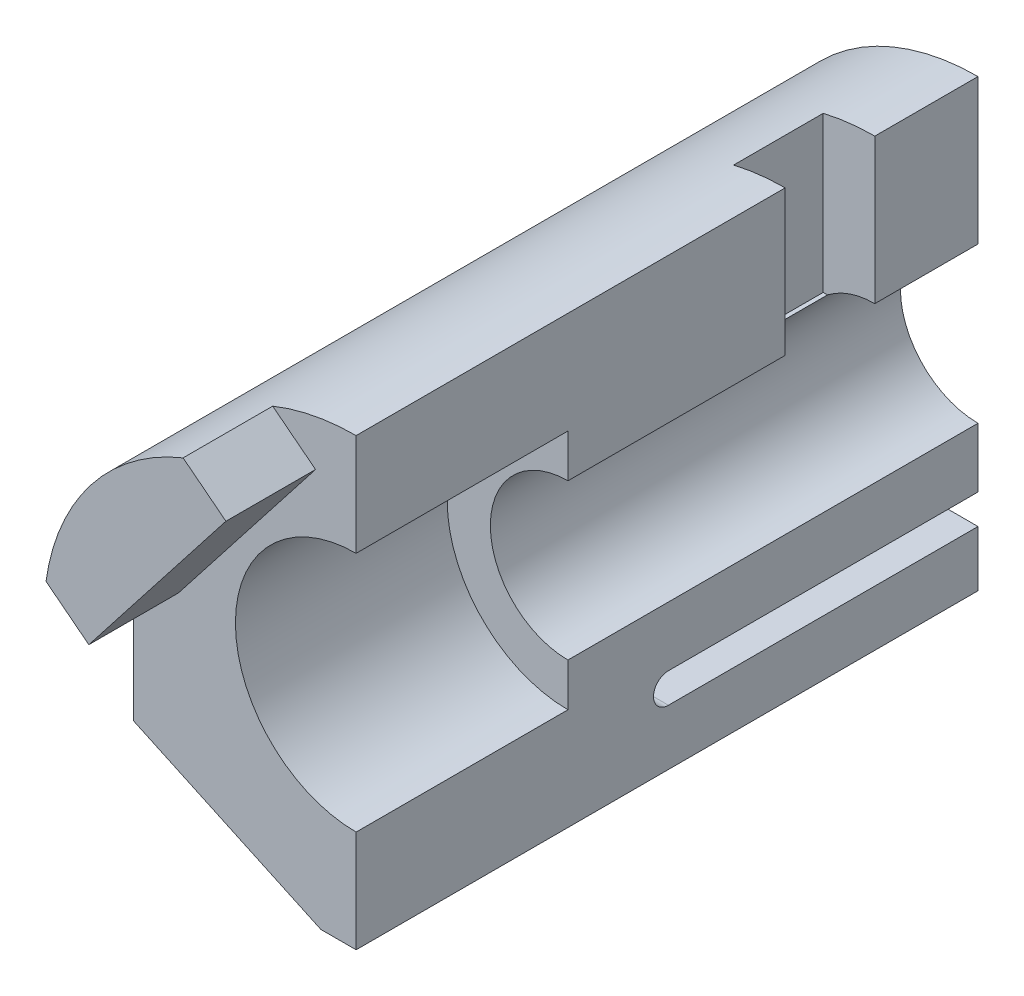
ISO-10303-21;
HEADER;
FILE_DESCRIPTION(('STEP AP214'),'2;1');
FILE_NAME('part.step','',(''),(''),'','','');
FILE_SCHEMA(('AUTOMOTIVE_DESIGN { 1 0 10303 214 1 1 1 1 }'));
ENDSEC;
DATA;
#1=APPLICATION_CONTEXT('core data for automotive mechanical design processes');
#2=APPLICATION_PROTOCOL_DEFINITION('international standard','automotive_design',2000,#1);
#3=PRODUCT_CONTEXT('',#1,'mechanical');
#4=PRODUCT('Part','Part','',(#3));
#5=PRODUCT_RELATED_PRODUCT_CATEGORY('part','',(#4));
#6=PRODUCT_DEFINITION_FORMATION('','',#4);
#7=PRODUCT_DEFINITION_CONTEXT('part definition',#1,'design');
#8=PRODUCT_DEFINITION('design','',#6,#7);
#9=PRODUCT_DEFINITION_SHAPE('','',#8);
#10=(LENGTH_UNIT() NAMED_UNIT(*) SI_UNIT(.MILLI.,.METRE.));
#11=(NAMED_UNIT(*) PLANE_ANGLE_UNIT() SI_UNIT($,.RADIAN.));
#12=(NAMED_UNIT(*) SI_UNIT($,.STERADIAN.) SOLID_ANGLE_UNIT());
#13=UNCERTAINTY_MEASURE_WITH_UNIT(LENGTH_MEASURE(1.E-05),#10,'distance_accuracy_value','');
#14=(GEOMETRIC_REPRESENTATION_CONTEXT(3) GLOBAL_UNCERTAINTY_ASSIGNED_CONTEXT((#13)) GLOBAL_UNIT_ASSIGNED_CONTEXT((#10,
#11,#12)) REPRESENTATION_CONTEXT('',''));
#15=CARTESIAN_POINT('',(0.,0.,0.));
#16=DIRECTION('',(0.,0.,1.));
#17=DIRECTION('',(1.,0.,0.));
#18=AXIS2_PLACEMENT_3D('',#15,#16,#17);
#19=CARTESIAN_POINT('',(0.,110.575,262.));
#20=DIRECTION('',(-1.,0.,0.));
#21=DIRECTION('',(0.,0.,1.));
#22=AXIS2_PLACEMENT_3D('',#19,#20,#21);
#23=PLANE('',#22);
#24=DIRECTION('',(0.,0.,-1.));
#25=VECTOR('',#24,1.);
#26=CARTESIAN_POINT('',(0.,110.575,262.));
#27=LINE('',#26,#25);
#28=CARTESIAN_POINT('',(0.,110.575,151.));
#29=VERTEX_POINT('',#28);
#30=CARTESIAN_POINT('',(0.,110.575,71.));
#31=VERTEX_POINT('',#30);
#32=EDGE_CURVE('E342',#29,#31,#27,.T.);
#33=ORIENTED_EDGE('',*,*,#32,.T.);
#34=DIRECTION('',(0.,-1.,0.));
#35=VECTOR('',#34,1.);
#36=CARTESIAN_POINT('',(0.,164.,71.));
#37=LINE('',#36,#35);
#38=CARTESIAN_POINT('',(0.,164.,71.));
#39=VERTEX_POINT('',#38);
#40=EDGE_CURVE('E222',#39,#31,#37,.T.);
#41=ORIENTED_EDGE('',*,*,#40,.F.);
#42=DIRECTION('',(0.,0.,-1.));
#43=VECTOR('',#42,1.);
#44=CARTESIAN_POINT('',(0.,164.,262.));
#45=LINE('',#44,#43);
#46=CARTESIAN_POINT('',(-2.86301469785137E-13,164.,229.));
#47=VERTEX_POINT('',#46);
#48=EDGE_CURVE('E338',#47,#39,#45,.T.);
#49=ORIENTED_EDGE('',*,*,#48,.F.);
#50=DIRECTION('',(0.,1.,0.));
#51=VECTOR('',#50,1.);
#52=CARTESIAN_POINT('',(0.,110.575,229.));
#53=LINE('',#52,#51);
#54=CARTESIAN_POINT('',(0.,126.45,229.));
#55=VERTEX_POINT('',#54);
#56=EDGE_CURVE('E273',#55,#47,#53,.T.);
#57=ORIENTED_EDGE('',*,*,#56,.F.);
#58=DIRECTION('',(0.,0.,1.));
#59=VECTOR('',#58,1.);
#60=CARTESIAN_POINT('',(0.,126.45,151.));
#61=LINE('',#60,#59);
#62=CARTESIAN_POINT('',(0.,126.45,151.));
#63=VERTEX_POINT('',#62);
#64=EDGE_CURVE('E251',#55,#63,#61,.F.);
#65=ORIENTED_EDGE('',*,*,#64,.T.);
#66=DIRECTION('',(0.,1.,0.));
#67=VECTOR('',#66,1.);
#68=CARTESIAN_POINT('',(0.,110.575,151.));
#69=LINE('',#68,#67);
#70=EDGE_CURVE('E348',#29,#63,#69,.T.);
#71=ORIENTED_EDGE('',*,*,#70,.F.);
#72=EDGE_LOOP('',(#33,#41,#49,#57,#65,#71));
#73=FACE_BOUND('',#72,.T.);
#74=ADVANCED_FACE('F41',(#73),#23,.F.);
#75=CARTESIAN_POINT('',(0.,82.,262.));
#76=DIRECTION('',(0.,0.,-1.));
#77=DIRECTION('',(-1.,0.,0.));
#78=AXIS2_PLACEMENT_3D('',#75,#76,#77);
#79=CYLINDRICAL_SURFACE('',#78,28.575);
#80=DIRECTION('',(0.,0.,-1.));
#81=VECTOR('',#80,1.);
#82=CARTESIAN_POINT('',(-17.4205892694087,104.650688609986,262.));
#83=LINE('',#82,#81);
#84=CARTESIAN_POINT('',(-17.4205892694087,104.650688609986,38.));
#85=VERTEX_POINT('',#84);
#86=CARTESIAN_POINT('',(-17.4205892694087,104.650688609986,71.));
#87=VERTEX_POINT('',#86);
#88=EDGE_CURVE('E11',#85,#87,#83,.F.);
#89=ORIENTED_EDGE('',*,*,#88,.T.);
#90=CARTESIAN_POINT('',(0.,82.,71.));
#91=DIRECTION('',(0.,0.,1.));
#92=DIRECTION('',(1.,0.,0.));
#93=AXIS2_PLACEMENT_3D('',#90,#91,#92);
#94=CIRCLE('',#93,28.575);
#95=EDGE_CURVE('E244',#87,#31,#94,.F.);
#96=ORIENTED_EDGE('',*,*,#95,.T.);
#97=ORIENTED_EDGE('',*,*,#32,.F.);
#98=CARTESIAN_POINT('',(0.,82.,151.));
#99=DIRECTION('',(0.,0.,1.));
#100=DIRECTION('',(1.,0.,0.));
#101=AXIS2_PLACEMENT_3D('',#98,#99,#100);
#102=CIRCLE('',#101,28.575);
#103=CARTESIAN_POINT('',(0.,53.425,151.));
#104=VERTEX_POINT('',#103);
#105=EDGE_CURVE('E258',#104,#29,#102,.F.);
#106=ORIENTED_EDGE('',*,*,#105,.F.);
#107=DIRECTION('',(0.,0.,-1.));
#108=VECTOR('',#107,1.);
#109=CARTESIAN_POINT('',(0.,53.425,262.));
#110=LINE('',#109,#108);
#111=CARTESIAN_POINT('',(0.,53.425,0.));
#112=VERTEX_POINT('',#111);
#113=EDGE_CURVE('E345',#104,#112,#110,.T.);
#114=ORIENTED_EDGE('',*,*,#113,.T.);
#115=CARTESIAN_POINT('',(0.,82.,0.));
#116=DIRECTION('',(0.,0.,-1.));
#117=DIRECTION('',(1.,0.,0.));
#118=AXIS2_PLACEMENT_3D('',#115,#116,#117);
#119=CIRCLE('',#118,28.575);
#120=CARTESIAN_POINT('',(0.,110.575,0.));
#121=VERTEX_POINT('',#120);
#122=EDGE_CURVE('E313',#112,#121,#119,.T.);
#123=ORIENTED_EDGE('',*,*,#122,.T.);
#124=CARTESIAN_POINT('',(0.,110.575,38.));
#125=VERTEX_POINT('',#124);
#126=EDGE_CURVE('E341',#125,#121,#27,.T.);
#127=ORIENTED_EDGE('',*,*,#126,.F.);
#128=CARTESIAN_POINT('',(0.,82.,38.));
#129=DIRECTION('',(0.,0.,-1.));
#130=DIRECTION('',(-1.,0.,0.));
#131=AXIS2_PLACEMENT_3D('',#128,#129,#130);
#132=CIRCLE('',#131,28.575);
#133=EDGE_CURVE('E239',#125,#85,#132,.F.);
#134=ORIENTED_EDGE('',*,*,#133,.T.);
#135=EDGE_LOOP('',(#89,#96,#97,#106,#114,#123,#127,#134));
#136=FACE_BOUND('',#135,.T.);
#137=ADVANCED_FACE('F371',(#136),#79,.F.);
#138=CARTESIAN_POINT('',(0.,53.425,262.));
#139=DIRECTION('',(-1.,0.,0.));
#140=DIRECTION('',(0.,-1.,0.));
#141=AXIS2_PLACEMENT_3D('',#138,#139,#140);
#142=PLANE('',#141);
#143=CARTESIAN_POINT('',(0.,26.,114.));
#144=DIRECTION('',(1.,0.,0.));
#145=DIRECTION('',(0.,1.,0.));
#146=AXIS2_PLACEMENT_3D('',#143,#144,#145);
#147=CIRCLE('',#146,5.5);
#148=CARTESIAN_POINT('',(0.,31.5,114.));
#149=VERTEX_POINT('',#148);
#150=CARTESIAN_POINT('',(0.,20.5,114.));
#151=VERTEX_POINT('',#150);
#152=EDGE_CURVE('E213',#149,#151,#147,.T.);
#153=ORIENTED_EDGE('',*,*,#152,.F.);
#154=DIRECTION('',(0.,0.,1.));
#155=VECTOR('',#154,1.);
#156=CARTESIAN_POINT('',(0.,31.5,0.));
#157=LINE('',#156,#155);
#158=CARTESIAN_POINT('',(0.,31.5,0.));
#159=VERTEX_POINT('',#158);
#160=EDGE_CURVE('E198',#159,#149,#157,.T.);
#161=ORIENTED_EDGE('',*,*,#160,.F.);
#162=DIRECTION('',(0.,1.,0.));
#163=VECTOR('',#162,1.);
#164=CARTESIAN_POINT('',(0.,53.425,0.));
#165=LINE('',#164,#163);
#166=EDGE_CURVE('E299',#159,#112,#165,.T.);
#167=ORIENTED_EDGE('',*,*,#166,.T.);
#168=ORIENTED_EDGE('',*,*,#113,.F.);
#169=DIRECTION('',(0.,1.,0.));
#170=VECTOR('',#169,1.);
#171=CARTESIAN_POINT('',(0.,53.425,151.));
#172=LINE('',#171,#170);
#173=CARTESIAN_POINT('',(0.,37.55,151.));
#174=VERTEX_POINT('',#173);
#175=EDGE_CURVE('E260',#174,#104,#172,.T.);
#176=ORIENTED_EDGE('',*,*,#175,.F.);
#177=DIRECTION('',(0.,0.,1.));
#178=VECTOR('',#177,1.);
#179=CARTESIAN_POINT('',(0.,37.55,151.));
#180=LINE('',#179,#178);
#181=CARTESIAN_POINT('',(2.10369429636891E-13,37.55,229.));
#182=VERTEX_POINT('',#181);
#183=EDGE_CURVE('E255',#174,#182,#180,.T.);
#184=ORIENTED_EDGE('',*,*,#183,.T.);
#185=DIRECTION('',(0.,1.,0.));
#186=VECTOR('',#185,1.);
#187=CARTESIAN_POINT('',(2.99307237772328E-13,53.425,229.));
#188=LINE('',#187,#186);
#189=CARTESIAN_POINT('',(0.,0.,229.));
#190=VERTEX_POINT('',#189);
#191=EDGE_CURVE('E270',#190,#182,#188,.T.);
#192=ORIENTED_EDGE('',*,*,#191,.F.);
#193=DIRECTION('',(0.,0.,-1.));
#194=VECTOR('',#193,1.);
#195=CARTESIAN_POINT('',(0.,0.,262.));
#196=LINE('',#195,#194);
#197=CARTESIAN_POINT('',(0.,0.,0.));
#198=VERTEX_POINT('',#197);
#199=EDGE_CURVE('E308',#190,#198,#196,.T.);
#200=ORIENTED_EDGE('',*,*,#199,.T.);
#201=CARTESIAN_POINT('',(0.,20.5,0.));
#202=VERTEX_POINT('',#201);
#203=EDGE_CURVE('E310',#198,#202,#165,.T.);
#204=ORIENTED_EDGE('',*,*,#203,.T.);
#205=DIRECTION('',(0.,0.,-1.));
#206=VECTOR('',#205,1.);
#207=CARTESIAN_POINT('',(0.,20.5,0.));
#208=LINE('',#207,#206);
#209=EDGE_CURVE('E211',#151,#202,#208,.T.);
#210=ORIENTED_EDGE('',*,*,#209,.F.);
#211=EDGE_LOOP('',(#153,#161,#167,#168,#176,#184,#192,#200,#204,#210));
#212=FACE_BOUND('',#211,.T.);
#213=ADVANCED_FACE('F43',(#212),#142,.F.);
#214=CARTESIAN_POINT('',(0.,164.,38.));
#215=VERTEX_POINT('',#214);
#216=CARTESIAN_POINT('',(0.,164.,0.));
#217=VERTEX_POINT('',#216);
#218=EDGE_CURVE('E337',#215,#217,#45,.T.);
#219=ORIENTED_EDGE('',*,*,#218,.F.);
#220=DIRECTION('',(0.,1.,0.));
#221=VECTOR('',#220,1.);
#222=CARTESIAN_POINT('',(0.,104.650688609986,38.));
#223=LINE('',#222,#221);
#224=EDGE_CURVE('E230',#125,#215,#223,.T.);
#225=ORIENTED_EDGE('',*,*,#224,.F.);
#226=ORIENTED_EDGE('',*,*,#126,.T.);
#227=DIRECTION('',(0.,1.,0.));
#228=VECTOR('',#227,1.);
#229=CARTESIAN_POINT('',(0.,110.575,0.));
#230=LINE('',#229,#228);
#231=EDGE_CURVE('E316',#121,#217,#230,.T.);
#232=ORIENTED_EDGE('',*,*,#231,.T.);
#233=EDGE_LOOP('',(#219,#225,#226,#232));
#234=FACE_BOUND('',#233,.T.);
#235=ADVANCED_FACE('F390',(#234),#23,.F.);
#236=CARTESIAN_POINT('',(-82.,32.051995773414,262.));
#237=DIRECTION('',(1.,0.,0.));
#238=DIRECTION('',(0.,0.,-1.));
#239=AXIS2_PLACEMENT_3D('',#236,#237,#238);
#240=PLANE('',#239);
#241=DIRECTION('',(0.,-1.,0.));
#242=VECTOR('',#241,1.);
#243=CARTESIAN_POINT('',(-82.,32.051995773414,229.));
#244=LINE('',#243,#242);
#245=CARTESIAN_POINT('',(-82.,82.,229.));
#246=VERTEX_POINT('',#245);
#247=CARTESIAN_POINT('',(-82.,32.051995773414,229.));
#248=VERTEX_POINT('',#247);
#249=EDGE_CURVE('E263',#246,#248,#244,.T.);
#250=ORIENTED_EDGE('',*,*,#249,.F.);
#251=DIRECTION('',(0.,0.,-1.));
#252=VECTOR('',#251,1.);
#253=CARTESIAN_POINT('',(-82.,82.,262.));
#254=LINE('',#253,#252);
#255=CARTESIAN_POINT('',(-82.,82.,0.));
#256=VERTEX_POINT('',#255);
#257=EDGE_CURVE('E335',#246,#256,#254,.T.);
#258=ORIENTED_EDGE('',*,*,#257,.T.);
#259=DIRECTION('',(0.,-1.,0.));
#260=VECTOR('',#259,1.);
#261=CARTESIAN_POINT('',(-82.,32.051995773414,0.));
#262=LINE('',#261,#260);
#263=CARTESIAN_POINT('',(-82.,32.051995773414,0.));
#264=VERTEX_POINT('',#263);
#265=EDGE_CURVE('E322',#256,#264,#262,.T.);
#266=ORIENTED_EDGE('',*,*,#265,.T.);
#267=DIRECTION('',(0.,0.,-1.));
#268=VECTOR('',#267,1.);
#269=CARTESIAN_POINT('',(-82.,32.051995773414,262.));
#270=LINE('',#269,#268);
#271=EDGE_CURVE('E333',#248,#264,#270,.T.);
#272=ORIENTED_EDGE('',*,*,#271,.F.);
#273=EDGE_LOOP('',(#250,#258,#266,#272));
#274=FACE_BOUND('',#273,.T.);
#275=ADVANCED_FACE('F396',(#274),#240,.F.);
#276=CARTESIAN_POINT('',(-13.,0.,262.));
#277=DIRECTION('',(0.421287350370533,0.90692721230415,0.));
#278=DIRECTION('',(-0.90692721230415,0.421287350370533,0.));
#279=AXIS2_PLACEMENT_3D('',#276,#277,#278);
#280=PLANE('',#279);
#281=DIRECTION('',(0.90692721230415,-0.421287350370533,0.));
#282=VECTOR('',#281,1.);
#283=CARTESIAN_POINT('',(-82.,32.051995773414,229.));
#284=LINE('',#283,#282);
#285=CARTESIAN_POINT('',(-13.,0.,229.));
#286=VERTEX_POINT('',#285);
#287=EDGE_CURVE('E265',#248,#286,#284,.T.);
#288=ORIENTED_EDGE('',*,*,#287,.F.);
#289=ORIENTED_EDGE('',*,*,#271,.T.);
#290=DIRECTION('',(0.90692721230415,-0.421287350370533,0.));
#291=VECTOR('',#290,1.);
#292=CARTESIAN_POINT('',(-13.,0.,0.));
#293=LINE('',#292,#291);
#294=CARTESIAN_POINT('',(-13.,0.,0.));
#295=VERTEX_POINT('',#294);
#296=EDGE_CURVE('E325',#264,#295,#293,.T.);
#297=ORIENTED_EDGE('',*,*,#296,.T.);
#298=DIRECTION('',(0.,0.,-1.));
#299=VECTOR('',#298,1.);
#300=CARTESIAN_POINT('',(-13.,0.,262.));
#301=LINE('',#300,#299);
#302=EDGE_CURVE('E331',#286,#295,#301,.T.);
#303=ORIENTED_EDGE('',*,*,#302,.F.);
#304=EDGE_LOOP('',(#288,#289,#297,#303));
#305=FACE_BOUND('',#304,.T.);
#306=ADVANCED_FACE('F402',(#305),#280,.F.);
#307=CARTESIAN_POINT('',(0.,0.,262.));
#308=DIRECTION('',(0.,1.,0.));
#309=DIRECTION('',(0.,0.,1.));
#310=AXIS2_PLACEMENT_3D('',#307,#308,#309);
#311=PLANE('',#310);
#312=DIRECTION('',(1.,0.,0.));
#313=VECTOR('',#312,1.);
#314=CARTESIAN_POINT('',(-13.,0.,229.));
#315=LINE('',#314,#313);
#316=EDGE_CURVE('E268',#286,#190,#315,.T.);
#317=ORIENTED_EDGE('',*,*,#316,.F.);
#318=ORIENTED_EDGE('',*,*,#302,.T.);
#319=DIRECTION('',(1.,0.,0.));
#320=VECTOR('',#319,1.);
#321=CARTESIAN_POINT('',(0.,0.,0.));
#322=LINE('',#321,#320);
#323=EDGE_CURVE('E309',#295,#198,#322,.T.);
#324=ORIENTED_EDGE('',*,*,#323,.T.);
#325=ORIENTED_EDGE('',*,*,#199,.F.);
#326=EDGE_LOOP('',(#317,#318,#324,#325));
#327=FACE_BOUND('',#326,.T.);
#328=ADVANCED_FACE('F452',(#327),#311,.F.);
#329=CARTESIAN_POINT('',(0.,82.,262.));
#330=DIRECTION('',(0.,0.,-1.));
#331=DIRECTION('',(-1.,0.,0.));
#332=AXIS2_PLACEMENT_3D('',#329,#330,#331);
#333=CYLINDRICAL_SURFACE('',#332,82.);
#334=ORIENTED_EDGE('',*,*,#48,.T.);
#335=CARTESIAN_POINT('',(0.,82.,71.));
#336=DIRECTION('',(0.,0.,1.));
#337=DIRECTION('',(1.,0.,0.));
#338=AXIS2_PLACEMENT_3D('',#335,#336,#337);
#339=CIRCLE('',#338,82.);
#340=CARTESIAN_POINT('',(-19.,161.76841480185,71.));
#341=VERTEX_POINT('',#340);
#342=EDGE_CURVE('E49',#39,#341,#339,.T.);
#343=ORIENTED_EDGE('',*,*,#342,.T.);
#344=DIRECTION('',(0.,0.,-1.));
#345=VECTOR('',#344,1.);
#346=CARTESIAN_POINT('',(-19.,161.76841480185,262.));
#347=LINE('',#346,#345);
#348=CARTESIAN_POINT('',(-19.,161.76841480185,38.));
#349=VERTEX_POINT('',#348);
#350=EDGE_CURVE('E350',#349,#341,#347,.F.);
#351=ORIENTED_EDGE('',*,*,#350,.F.);
#352=CARTESIAN_POINT('',(0.,82.,38.));
#353=DIRECTION('',(0.,0.,-1.));
#354=DIRECTION('',(-1.,0.,0.));
#355=AXIS2_PLACEMENT_3D('',#352,#353,#354);
#356=CIRCLE('',#355,82.);
#357=EDGE_CURVE('E352',#349,#215,#356,.T.);
#358=ORIENTED_EDGE('',*,*,#357,.T.);
#359=ORIENTED_EDGE('',*,*,#218,.T.);
#360=CARTESIAN_POINT('',(0.,82.,0.));
#361=DIRECTION('',(0.,0.,1.));
#362=DIRECTION('',(1.,0.,0.));
#363=AXIS2_PLACEMENT_3D('',#360,#361,#362);
#364=CIRCLE('',#363,82.);
#365=EDGE_CURVE('E319',#217,#256,#364,.T.);
#366=ORIENTED_EDGE('',*,*,#365,.T.);
#367=ORIENTED_EDGE('',*,*,#257,.F.);
#368=CARTESIAN_POINT('',(0.,82.,229.));
#369=DIRECTION('',(0.,0.,1.));
#370=DIRECTION('',(1.,0.,0.));
#371=AXIS2_PLACEMENT_3D('',#368,#369,#370);
#372=CIRCLE('',#371,82.);
#373=CARTESIAN_POINT('',(-81.2019816368088,93.4121942787248,229.));
#374=VERTEX_POINT('',#373);
#375=EDGE_CURVE('E287',#374,#246,#372,.T.);
#376=ORIENTED_EDGE('',*,*,#375,.F.);
#377=DIRECTION('',(0.,0.,1.));
#378=VECTOR('',#377,1.);
#379=CARTESIAN_POINT('',(-81.2019816368088,93.4121942787248,229.));
#380=LINE('',#379,#378);
#381=CARTESIAN_POINT('',(-81.2019816368088,93.4121942787248,262.));
#382=VERTEX_POINT('',#381);
#383=EDGE_CURVE('E296',#374,#382,#380,.T.);
#384=ORIENTED_EDGE('',*,*,#383,.T.);
#385=CARTESIAN_POINT('',(0.,82.,262.));
#386=DIRECTION('',(0.,0.,1.));
#387=DIRECTION('',(1.,0.,0.));
#388=AXIS2_PLACEMENT_3D('',#385,#386,#387);
#389=CIRCLE('',#388,82.);
#390=CARTESIAN_POINT('',(-30.7177406601053,158.029076074476,262.));
#391=VERTEX_POINT('',#390);
#392=EDGE_CURVE('E305',#391,#382,#389,.T.);
#393=ORIENTED_EDGE('',*,*,#392,.F.);
#394=DIRECTION('',(0.,0.,1.));
#395=VECTOR('',#394,1.);
#396=CARTESIAN_POINT('',(-30.7177406601053,158.029076074476,229.));
#397=LINE('',#396,#395);
#398=CARTESIAN_POINT('',(-30.7177406601053,158.029076074476,229.));
#399=VERTEX_POINT('',#398);
#400=EDGE_CURVE('E289',#399,#391,#397,.T.);
#401=ORIENTED_EDGE('',*,*,#400,.F.);
#402=CARTESIAN_POINT('',(0.,82.,229.));
#403=DIRECTION('',(0.,0.,1.));
#404=DIRECTION('',(1.,0.,0.));
#405=AXIS2_PLACEMENT_3D('',#402,#403,#404);
#406=CIRCLE('',#405,82.);
#407=EDGE_CURVE('E275',#47,#399,#406,.T.);
#408=ORIENTED_EDGE('',*,*,#407,.F.);
#409=EDGE_LOOP('',(#334,#343,#351,#358,#359,#366,#367,#376,#384,#393,#401,#408));
#410=FACE_BOUND('',#409,.T.);
#411=ADVANCED_FACE('F357',(#410),#333,.T.);
#412=CARTESIAN_POINT('',(0.,82.,262.));
#413=DIRECTION('',(0.,0.,1.));
#414=DIRECTION('',(1.,0.,0.));
#415=AXIS2_PLACEMENT_3D('',#412,#413,#414);
#416=PLANE('',#415);
#417=DIRECTION('',(-0.788010753606727,0.615661475325652,0.));
#418=VECTOR('',#417,1.);
#419=CARTESIAN_POINT('',(-65.4306689222948,81.0902943437326,262.));
#420=LINE('',#419,#418);
#421=CARTESIAN_POINT('',(-65.4306689222948,81.0902943437326,262.));
#422=VERTEX_POINT('',#421);
#423=EDGE_CURVE('E266',#422,#382,#420,.T.);
#424=ORIENTED_EDGE('',*,*,#423,.F.);
#425=DIRECTION('',(-0.615661475325653,-0.788010753606726,0.));
#426=VECTOR('',#425,1.);
#427=CARTESIAN_POINT('',(-14.9464279455913,145.707176139484,262.));
#428=LINE('',#427,#426);
#429=CARTESIAN_POINT('',(-14.9464279455913,145.707176139484,262.));
#430=VERTEX_POINT('',#429);
#431=EDGE_CURVE('E292',#430,#422,#428,.T.);
#432=ORIENTED_EDGE('',*,*,#431,.F.);
#433=DIRECTION('',(0.788010753606725,-0.615661475325654,0.));
#434=VECTOR('',#433,1.);
#435=CARTESIAN_POINT('',(-14.9464279455913,145.707176139484,262.));
#436=LINE('',#435,#434);
#437=EDGE_CURVE('E262',#391,#430,#436,.T.);
#438=ORIENTED_EDGE('',*,*,#437,.F.);
#439=ORIENTED_EDGE('',*,*,#392,.T.);
#440=EDGE_LOOP('',(#424,#432,#438,#439));
#441=FACE_BOUND('',#440,.T.);
#442=ADVANCED_FACE('F434',(#441),#416,.T.);
#443=CARTESIAN_POINT('',(0.,82.,0.));
#444=DIRECTION('',(0.,0.,1.));
#445=DIRECTION('',(1.,0.,0.));
#446=AXIS2_PLACEMENT_3D('',#443,#444,#445);
#447=PLANE('',#446);
#448=ORIENTED_EDGE('',*,*,#166,.F.);
#449=DIRECTION('',(1.,0.,0.));
#450=VECTOR('',#449,1.);
#451=CARTESIAN_POINT('',(-13.,31.5,0.));
#452=LINE('',#451,#450);
#453=CARTESIAN_POINT('',(-13.,31.5,0.));
#454=VERTEX_POINT('',#453);
#455=EDGE_CURVE('E220',#454,#159,#452,.T.);
#456=ORIENTED_EDGE('',*,*,#455,.F.);
#457=DIRECTION('',(0.,1.,0.));
#458=VECTOR('',#457,1.);
#459=CARTESIAN_POINT('',(-13.,0.,0.));
#460=LINE('',#459,#458);
#461=CARTESIAN_POINT('',(-13.,20.5,0.));
#462=VERTEX_POINT('',#461);
#463=EDGE_CURVE('E203',#462,#454,#460,.T.);
#464=ORIENTED_EDGE('',*,*,#463,.F.);
#465=DIRECTION('',(1.,0.,0.));
#466=VECTOR('',#465,1.);
#467=CARTESIAN_POINT('',(-13.,20.5,0.));
#468=LINE('',#467,#466);
#469=EDGE_CURVE('E223',#462,#202,#468,.T.);
#470=ORIENTED_EDGE('',*,*,#469,.T.);
#471=ORIENTED_EDGE('',*,*,#203,.F.);
#472=ORIENTED_EDGE('',*,*,#323,.F.);
#473=ORIENTED_EDGE('',*,*,#296,.F.);
#474=ORIENTED_EDGE('',*,*,#265,.F.);
#475=ORIENTED_EDGE('',*,*,#365,.F.);
#476=ORIENTED_EDGE('',*,*,#231,.F.);
#477=ORIENTED_EDGE('',*,*,#122,.F.);
#478=EDGE_LOOP('',(#448,#456,#464,#470,#471,#472,#473,#474,#475,#476,#477));
#479=FACE_BOUND('',#478,.T.);
#480=ADVANCED_FACE('F416',(#479),#447,.F.);
#481=CARTESIAN_POINT('',(-65.4306689222948,81.0902943437326,229.));
#482=DIRECTION('',(0.615661475325652,0.788010753606727,0.));
#483=DIRECTION('',(-0.788010753606727,0.615661475325652,0.));
#484=AXIS2_PLACEMENT_3D('',#481,#482,#483);
#485=PLANE('',#484);
#486=ORIENTED_EDGE('',*,*,#423,.T.);
#487=ORIENTED_EDGE('',*,*,#383,.F.);
#488=DIRECTION('',(-0.788010753606727,0.615661475325652,0.));
#489=VECTOR('',#488,1.);
#490=CARTESIAN_POINT('',(-65.4306689222948,81.0902943437326,229.));
#491=LINE('',#490,#489);
#492=CARTESIAN_POINT('',(-65.4306689222948,81.0902943437326,229.));
#493=VERTEX_POINT('',#492);
#494=EDGE_CURVE('E284',#493,#374,#491,.T.);
#495=ORIENTED_EDGE('',*,*,#494,.F.);
#496=DIRECTION('',(0.,0.,1.));
#497=VECTOR('',#496,1.);
#498=CARTESIAN_POINT('',(-65.4306689222948,81.0902943437326,229.));
#499=LINE('',#498,#497);
#500=EDGE_CURVE('E300',#493,#422,#499,.T.);
#501=ORIENTED_EDGE('',*,*,#500,.T.);
#502=EDGE_LOOP('',(#486,#487,#495,#501));
#503=FACE_BOUND('',#502,.T.);
#504=ADVANCED_FACE('F430',(#503),#485,.F.);
#505=CARTESIAN_POINT('',(-14.9464279455913,145.707176139484,229.));
#506=DIRECTION('',(-0.788010753606726,0.615661475325653,0.));
#507=DIRECTION('',(-0.615661475325653,-0.788010753606726,0.));
#508=AXIS2_PLACEMENT_3D('',#505,#506,#507);
#509=PLANE('',#508);
#510=ORIENTED_EDGE('',*,*,#431,.T.);
#511=ORIENTED_EDGE('',*,*,#500,.F.);
#512=DIRECTION('',(-0.615661475325653,-0.788010753606726,0.));
#513=VECTOR('',#512,1.);
#514=CARTESIAN_POINT('',(-14.9464279455913,145.707176139484,229.));
#515=LINE('',#514,#513);
#516=CARTESIAN_POINT('',(-14.9464279455913,145.707176139484,229.));
#517=VERTEX_POINT('',#516);
#518=EDGE_CURVE('E281',#517,#493,#515,.T.);
#519=ORIENTED_EDGE('',*,*,#518,.F.);
#520=DIRECTION('',(0.,0.,1.));
#521=VECTOR('',#520,1.);
#522=CARTESIAN_POINT('',(-14.9464279455913,145.707176139484,229.));
#523=LINE('',#522,#521);
#524=EDGE_CURVE('E302',#517,#430,#523,.T.);
#525=ORIENTED_EDGE('',*,*,#524,.T.);
#526=EDGE_LOOP('',(#510,#511,#519,#525));
#527=FACE_BOUND('',#526,.T.);
#528=ADVANCED_FACE('F473',(#527),#509,.F.);
#529=CARTESIAN_POINT('',(-14.9464279455913,145.707176139484,229.));
#530=DIRECTION('',(-0.615661475325654,-0.788010753606725,0.));
#531=DIRECTION('',(0.788010753606725,-0.615661475325654,0.));
#532=AXIS2_PLACEMENT_3D('',#529,#530,#531);
#533=PLANE('',#532);
#534=ORIENTED_EDGE('',*,*,#437,.T.);
#535=ORIENTED_EDGE('',*,*,#524,.F.);
#536=DIRECTION('',(0.788010753606725,-0.615661475325654,0.));
#537=VECTOR('',#536,1.);
#538=CARTESIAN_POINT('',(-14.9464279455913,145.707176139484,229.));
#539=LINE('',#538,#537);
#540=EDGE_CURVE('E278',#399,#517,#539,.T.);
#541=ORIENTED_EDGE('',*,*,#540,.F.);
#542=ORIENTED_EDGE('',*,*,#400,.T.);
#543=EDGE_LOOP('',(#534,#535,#541,#542));
#544=FACE_BOUND('',#543,.T.);
#545=ADVANCED_FACE('F438',(#544),#533,.F.);
#546=CARTESIAN_POINT('',(0.,82.,229.));
#547=DIRECTION('',(0.,0.,1.));
#548=DIRECTION('',(1.,0.,0.));
#549=AXIS2_PLACEMENT_3D('',#546,#547,#548);
#550=PLANE('',#549);
#551=CARTESIAN_POINT('',(0.,82.,229.));
#552=DIRECTION('',(0.,0.,1.));
#553=DIRECTION('',(1.,0.,0.));
#554=AXIS2_PLACEMENT_3D('',#551,#552,#553);
#555=CIRCLE('',#554,44.45);
#556=EDGE_CURVE('E247',#55,#182,#555,.T.);
#557=ORIENTED_EDGE('',*,*,#556,.F.);
#558=ORIENTED_EDGE('',*,*,#56,.T.);
#559=ORIENTED_EDGE('',*,*,#407,.T.);
#560=ORIENTED_EDGE('',*,*,#540,.T.);
#561=ORIENTED_EDGE('',*,*,#518,.T.);
#562=ORIENTED_EDGE('',*,*,#494,.T.);
#563=ORIENTED_EDGE('',*,*,#375,.T.);
#564=ORIENTED_EDGE('',*,*,#249,.T.);
#565=ORIENTED_EDGE('',*,*,#287,.T.);
#566=ORIENTED_EDGE('',*,*,#316,.T.);
#567=ORIENTED_EDGE('',*,*,#191,.T.);
#568=EDGE_LOOP('',(#557,#558,#559,#560,#561,#562,#563,#564,#565,#566,#567));
#569=FACE_BOUND('',#568,.T.);
#570=ADVANCED_FACE('F425',(#569),#550,.T.);
#571=CARTESIAN_POINT('',(0.,82.,151.));
#572=DIRECTION('',(0.,0.,1.));
#573=DIRECTION('',(1.,0.,0.));
#574=AXIS2_PLACEMENT_3D('',#571,#572,#573);
#575=PLANE('',#574);
#576=ORIENTED_EDGE('',*,*,#175,.T.);
#577=ORIENTED_EDGE('',*,*,#105,.T.);
#578=ORIENTED_EDGE('',*,*,#70,.T.);
#579=CARTESIAN_POINT('',(0.,82.,151.));
#580=DIRECTION('',(0.,0.,1.));
#581=DIRECTION('',(1.,0.,0.));
#582=AXIS2_PLACEMENT_3D('',#579,#580,#581);
#583=CIRCLE('',#582,44.45);
#584=EDGE_CURVE('E248',#63,#174,#583,.T.);
#585=ORIENTED_EDGE('',*,*,#584,.T.);
#586=EDGE_LOOP('',(#576,#577,#578,#585));
#587=FACE_BOUND('',#586,.T.);
#588=ADVANCED_FACE('F444',(#587),#575,.T.);
#589=CARTESIAN_POINT('',(0.,82.,151.));
#590=DIRECTION('',(0.,0.,1.));
#591=DIRECTION('',(1.,0.,0.));
#592=AXIS2_PLACEMENT_3D('',#589,#590,#591);
#593=CYLINDRICAL_SURFACE('',#592,44.45);
#594=ORIENTED_EDGE('',*,*,#584,.F.);
#595=ORIENTED_EDGE('',*,*,#64,.F.);
#596=ORIENTED_EDGE('',*,*,#556,.T.);
#597=ORIENTED_EDGE('',*,*,#183,.F.);
#598=EDGE_LOOP('',(#594,#595,#596,#597));
#599=FACE_BOUND('',#598,.T.);
#600=ADVANCED_FACE('F441',(#599),#593,.F.);
#601=CARTESIAN_POINT('',(-19.,104.650688609986,71.));
#602=DIRECTION('',(0.,-1.,0.));
#603=DIRECTION('',(0.,0.,-1.));
#604=AXIS2_PLACEMENT_3D('',#601,#602,#603);
#605=PLANE('',#604);
#606=DIRECTION('',(1.,0.,0.));
#607=VECTOR('',#606,1.);
#608=CARTESIAN_POINT('',(-19.,104.650688609986,38.));
#609=LINE('',#608,#607);
#610=CARTESIAN_POINT('',(-19.,104.650688609986,38.));
#611=VERTEX_POINT('',#610);
#612=EDGE_CURVE('E236',#611,#85,#609,.T.);
#613=ORIENTED_EDGE('',*,*,#612,.F.);
#614=DIRECTION('',(0.,0.,-1.));
#615=VECTOR('',#614,1.);
#616=CARTESIAN_POINT('',(-19.,104.650688609986,71.));
#617=LINE('',#616,#615);
#618=CARTESIAN_POINT('',(-19.,104.650688609986,71.));
#619=VERTEX_POINT('',#618);
#620=EDGE_CURVE('E229',#619,#611,#617,.T.);
#621=ORIENTED_EDGE('',*,*,#620,.F.);
#622=DIRECTION('',(1.,0.,0.));
#623=VECTOR('',#622,1.);
#624=CARTESIAN_POINT('',(-19.,104.650688609986,71.));
#625=LINE('',#624,#623);
#626=EDGE_CURVE('E233',#619,#87,#625,.T.);
#627=ORIENTED_EDGE('',*,*,#626,.T.);
#628=ORIENTED_EDGE('',*,*,#88,.F.);
#629=EDGE_LOOP('',(#613,#621,#627,#628));
#630=FACE_BOUND('',#629,.T.);
#631=ADVANCED_FACE('F375',(#630),#605,.F.);
#632=CARTESIAN_POINT('',(-19.,164.,71.));
#633=DIRECTION('',(0.,0.,1.));
#634=DIRECTION('',(1.,0.,0.));
#635=AXIS2_PLACEMENT_3D('',#632,#633,#634);
#636=PLANE('',#635);
#637=ORIENTED_EDGE('',*,*,#626,.F.);
#638=DIRECTION('',(0.,-1.,0.));
#639=VECTOR('',#638,1.);
#640=CARTESIAN_POINT('',(-19.,164.,71.));
#641=LINE('',#640,#639);
#642=EDGE_CURVE('E227',#341,#619,#641,.T.);
#643=ORIENTED_EDGE('',*,*,#642,.F.);
#644=ORIENTED_EDGE('',*,*,#342,.F.);
#645=ORIENTED_EDGE('',*,*,#40,.T.);
#646=ORIENTED_EDGE('',*,*,#95,.F.);
#647=EDGE_LOOP('',(#637,#643,#644,#645,#646));
#648=FACE_BOUND('',#647,.T.);
#649=ADVANCED_FACE('F364',(#648),#636,.F.);
#650=CARTESIAN_POINT('',(-19.,104.650688609986,38.));
#651=DIRECTION('',(0.,0.,-1.));
#652=DIRECTION('',(-1.,0.,0.));
#653=AXIS2_PLACEMENT_3D('',#650,#651,#652);
#654=PLANE('',#653);
#655=ORIENTED_EDGE('',*,*,#224,.T.);
#656=ORIENTED_EDGE('',*,*,#357,.F.);
#657=DIRECTION('',(0.,1.,0.));
#658=VECTOR('',#657,1.);
#659=CARTESIAN_POINT('',(-19.,104.650688609986,38.));
#660=LINE('',#659,#658);
#661=EDGE_CURVE('E64',#611,#349,#660,.T.);
#662=ORIENTED_EDGE('',*,*,#661,.F.);
#663=ORIENTED_EDGE('',*,*,#612,.T.);
#664=ORIENTED_EDGE('',*,*,#133,.F.);
#665=EDGE_LOOP('',(#655,#656,#662,#663,#664));
#666=FACE_BOUND('',#665,.T.);
#667=ADVANCED_FACE('F378',(#666),#654,.F.);
#668=CARTESIAN_POINT('',(-19.,0.,0.));
#669=DIRECTION('',(1.,0.,0.));
#670=DIRECTION('',(0.,0.,-1.));
#671=AXIS2_PLACEMENT_3D('',#668,#669,#670);
#672=PLANE('',#671);
#673=ORIENTED_EDGE('',*,*,#350,.T.);
#674=ORIENTED_EDGE('',*,*,#642,.T.);
#675=ORIENTED_EDGE('',*,*,#620,.T.);
#676=ORIENTED_EDGE('',*,*,#661,.T.);
#677=EDGE_LOOP('',(#673,#674,#675,#676));
#678=FACE_BOUND('',#677,.T.);
#679=ADVANCED_FACE('F376',(#678),#672,.T.);
#680=CARTESIAN_POINT('',(-13.,31.5,0.));
#681=DIRECTION('',(0.,1.,0.));
#682=DIRECTION('',(0.,0.,1.));
#683=AXIS2_PLACEMENT_3D('',#680,#681,#682);
#684=PLANE('',#683);
#685=ORIENTED_EDGE('',*,*,#160,.T.);
#686=DIRECTION('',(1.,0.,0.));
#687=VECTOR('',#686,1.);
#688=CARTESIAN_POINT('',(-13.,31.5,114.));
#689=LINE('',#688,#687);
#690=CARTESIAN_POINT('',(-13.,31.5,114.));
#691=VERTEX_POINT('',#690);
#692=EDGE_CURVE('E192',#691,#149,#689,.T.);
#693=ORIENTED_EDGE('',*,*,#692,.F.);
#694=DIRECTION('',(0.,0.,1.));
#695=VECTOR('',#694,1.);
#696=CARTESIAN_POINT('',(-13.,31.5,0.));
#697=LINE('',#696,#695);
#698=EDGE_CURVE('E196',#454,#691,#697,.T.);
#699=ORIENTED_EDGE('',*,*,#698,.F.);
#700=ORIENTED_EDGE('',*,*,#455,.T.);
#701=EDGE_LOOP('',(#685,#693,#699,#700));
#702=FACE_BOUND('',#701,.T.);
#703=ADVANCED_FACE('F194',(#702),#684,.F.);
#704=CARTESIAN_POINT('',(-13.,20.5,0.));
#705=DIRECTION('',(0.,-1.,0.));
#706=DIRECTION('',(1.,0.,0.));
#707=AXIS2_PLACEMENT_3D('',#704,#705,#706);
#708=PLANE('',#707);
#709=ORIENTED_EDGE('',*,*,#209,.T.);
#710=ORIENTED_EDGE('',*,*,#469,.F.);
#711=DIRECTION('',(0.,0.,-1.));
#712=VECTOR('',#711,1.);
#713=CARTESIAN_POINT('',(-13.,20.5,0.));
#714=LINE('',#713,#712);
#715=CARTESIAN_POINT('',(-13.,20.5,114.));
#716=VERTEX_POINT('',#715);
#717=EDGE_CURVE('E56',#716,#462,#714,.T.);
#718=ORIENTED_EDGE('',*,*,#717,.F.);
#719=DIRECTION('',(1.,0.,0.));
#720=VECTOR('',#719,1.);
#721=CARTESIAN_POINT('',(-13.,20.5,114.));
#722=LINE('',#721,#720);
#723=EDGE_CURVE('E202',#716,#151,#722,.T.);
#724=ORIENTED_EDGE('',*,*,#723,.T.);
#725=EDGE_LOOP('',(#709,#710,#718,#724));
#726=FACE_BOUND('',#725,.T.);
#727=ADVANCED_FACE('F384',(#726),#708,.F.);
#728=CARTESIAN_POINT('',(-13.,26.,114.));
#729=DIRECTION('',(1.,0.,0.));
#730=DIRECTION('',(0.,1.,0.));
#731=AXIS2_PLACEMENT_3D('',#728,#729,#730);
#732=CYLINDRICAL_SURFACE('',#731,5.5);
#733=ORIENTED_EDGE('',*,*,#152,.T.);
#734=ORIENTED_EDGE('',*,*,#723,.F.);
#735=CARTESIAN_POINT('',(-13.,26.,114.));
#736=DIRECTION('',(1.,0.,0.));
#737=DIRECTION('',(0.,1.,0.));
#738=AXIS2_PLACEMENT_3D('',#735,#736,#737);
#739=CIRCLE('',#738,5.5);
#740=EDGE_CURVE('E205',#691,#716,#739,.T.);
#741=ORIENTED_EDGE('',*,*,#740,.F.);
#742=ORIENTED_EDGE('',*,*,#692,.T.);
#743=EDGE_LOOP('',(#733,#734,#741,#742));
#744=FACE_BOUND('',#743,.T.);
#745=ADVANCED_FACE('F206',(#744),#732,.F.);
#746=CARTESIAN_POINT('',(-13.,0.,0.));
#747=DIRECTION('',(1.,0.,0.));
#748=DIRECTION('',(0.,1.,0.));
#749=AXIS2_PLACEMENT_3D('',#746,#747,#748);
#750=PLANE('',#749);
#751=ORIENTED_EDGE('',*,*,#698,.T.);
#752=ORIENTED_EDGE('',*,*,#740,.T.);
#753=ORIENTED_EDGE('',*,*,#717,.T.);
#754=ORIENTED_EDGE('',*,*,#463,.T.);
#755=EDGE_LOOP('',(#751,#752,#753,#754));
#756=FACE_BOUND('',#755,.T.);
#757=ADVANCED_FACE('F208',(#756),#750,.T.);
#758=CLOSED_SHELL('',(#74,#137,#213,#235,#275,#306,#328,#411,#442,#480,#504,#528,#545,#570,#588,
#600,#631,#649,#667,#679,#703,#727,#745,#757));
#759=MANIFOLD_SOLID_BREP('B2',#758);
#760=ADVANCED_BREP_SHAPE_REPRESENTATION('',(#18,#759),#14);
#761=SHAPE_DEFINITION_REPRESENTATION(#9,#760);
ENDSEC;
END-ISO-10303-21;
